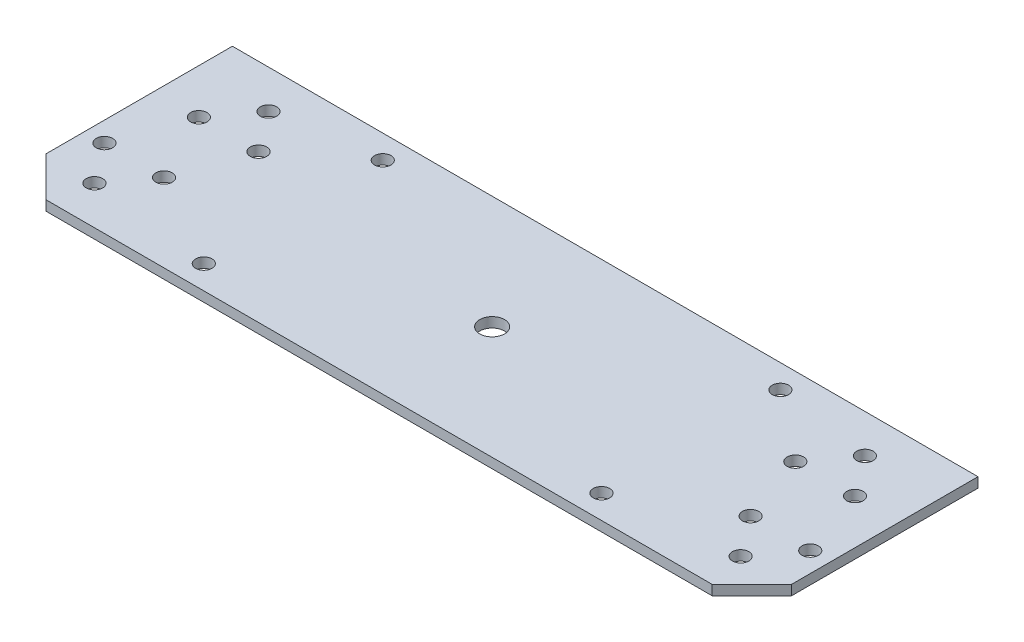
ISO-10303-21;
HEADER;
FILE_DESCRIPTION(('STEP AP214'),'2;1');
FILE_NAME('part.step','',(''),(''),'','','');
FILE_SCHEMA(('AUTOMOTIVE_DESIGN { 1 0 10303 214 1 1 1 1 }'));
ENDSEC;
DATA;
#1=APPLICATION_CONTEXT('core data for automotive mechanical design processes');
#2=APPLICATION_PROTOCOL_DEFINITION('international standard','automotive_design',2000,#1);
#3=PRODUCT_CONTEXT('',#1,'mechanical');
#4=PRODUCT('Part','Part','',(#3));
#5=PRODUCT_RELATED_PRODUCT_CATEGORY('part','',(#4));
#6=PRODUCT_DEFINITION_FORMATION('','',#4);
#7=PRODUCT_DEFINITION_CONTEXT('part definition',#1,'design');
#8=PRODUCT_DEFINITION('design','',#6,#7);
#9=PRODUCT_DEFINITION_SHAPE('','',#8);
#10=(LENGTH_UNIT() NAMED_UNIT(*) SI_UNIT(.MILLI.,.METRE.));
#11=(NAMED_UNIT(*) PLANE_ANGLE_UNIT() SI_UNIT($,.RADIAN.));
#12=(NAMED_UNIT(*) SI_UNIT($,.STERADIAN.) SOLID_ANGLE_UNIT());
#13=UNCERTAINTY_MEASURE_WITH_UNIT(LENGTH_MEASURE(1.E-05),#10,'distance_accuracy_value','');
#14=(GEOMETRIC_REPRESENTATION_CONTEXT(3) GLOBAL_UNCERTAINTY_ASSIGNED_CONTEXT((#13)) GLOBAL_UNIT_ASSIGNED_CONTEXT((#10,
#11,#12)) REPRESENTATION_CONTEXT('',''));
#15=CARTESIAN_POINT('',(0.,0.,0.));
#16=DIRECTION('',(0.,0.,1.));
#17=DIRECTION('',(1.,0.,0.));
#18=AXIS2_PLACEMENT_3D('',#15,#16,#17);
#19=CARTESIAN_POINT('',(75.,2.,22.75));
#20=DIRECTION('',(-1.,0.,0.));
#21=DIRECTION('',(0.,0.,1.));
#22=AXIS2_PLACEMENT_3D('',#19,#20,#21);
#23=PLANE('',#22);
#24=DIRECTION('',(0.,0.,-1.));
#25=VECTOR('',#24,1.);
#26=CARTESIAN_POINT('',(75.,2.,22.75));
#27=LINE('',#26,#25);
#28=CARTESIAN_POINT('',(75.,2.,14.75));
#29=VERTEX_POINT('',#28);
#30=CARTESIAN_POINT('',(75.,2.,-22.75));
#31=VERTEX_POINT('',#30);
#32=EDGE_CURVE('E89',#29,#31,#27,.T.);
#33=ORIENTED_EDGE('',*,*,#32,.F.);
#34=DIRECTION('',(0.,-1.,0.));
#35=VECTOR('',#34,1.);
#36=CARTESIAN_POINT('',(75.,2.,14.75));
#37=LINE('',#36,#35);
#38=CARTESIAN_POINT('',(75.,0.,14.75));
#39=VERTEX_POINT('',#38);
#40=EDGE_CURVE('E112',#29,#39,#37,.T.);
#41=ORIENTED_EDGE('',*,*,#40,.T.);
#42=DIRECTION('',(0.,0.,-1.));
#43=VECTOR('',#42,1.);
#44=CARTESIAN_POINT('',(75.,0.,22.75));
#45=LINE('',#44,#43);
#46=CARTESIAN_POINT('',(75.,0.,-22.75));
#47=VERTEX_POINT('',#46);
#48=EDGE_CURVE('E110',#39,#47,#45,.T.);
#49=ORIENTED_EDGE('',*,*,#48,.T.);
#50=DIRECTION('',(0.,-1.,0.));
#51=VECTOR('',#50,1.);
#52=CARTESIAN_POINT('',(75.,2.,-22.75));
#53=LINE('',#52,#51);
#54=EDGE_CURVE('E104',#31,#47,#53,.T.);
#55=ORIENTED_EDGE('',*,*,#54,.F.);
#56=EDGE_LOOP('',(#33,#41,#49,#55));
#57=FACE_BOUND('',#56,.T.);
#58=ADVANCED_FACE('F35',(#57),#23,.F.);
#59=CARTESIAN_POINT('',(-75.,2.,-22.75));
#60=DIRECTION('',(0.,0.,1.));
#61=DIRECTION('',(1.,0.,0.));
#62=AXIS2_PLACEMENT_3D('',#59,#60,#61);
#63=PLANE('',#62);
#64=DIRECTION('',(-1.,0.,0.));
#65=VECTOR('',#64,1.);
#66=CARTESIAN_POINT('',(-75.,0.,-22.75));
#67=LINE('',#66,#65);
#68=CARTESIAN_POINT('',(-75.,0.,-22.75));
#69=VERTEX_POINT('',#68);
#70=EDGE_CURVE('E139',#47,#69,#67,.T.);
#71=ORIENTED_EDGE('',*,*,#70,.T.);
#72=DIRECTION('',(0.,-1.,0.));
#73=VECTOR('',#72,1.);
#74=CARTESIAN_POINT('',(-75.,2.,-22.75));
#75=LINE('',#74,#73);
#76=CARTESIAN_POINT('',(-75.,2.,-22.75));
#77=VERTEX_POINT('',#76);
#78=EDGE_CURVE('E106',#77,#69,#75,.T.);
#79=ORIENTED_EDGE('',*,*,#78,.F.);
#80=DIRECTION('',(-1.,0.,0.));
#81=VECTOR('',#80,1.);
#82=CARTESIAN_POINT('',(-75.,2.,-22.75));
#83=LINE('',#82,#81);
#84=EDGE_CURVE('E92',#31,#77,#83,.T.);
#85=ORIENTED_EDGE('',*,*,#84,.F.);
#86=ORIENTED_EDGE('',*,*,#54,.T.);
#87=EDGE_LOOP('',(#71,#79,#85,#86));
#88=FACE_BOUND('',#87,.T.);
#89=ADVANCED_FACE('F103',(#88),#63,.F.);
#90=CARTESIAN_POINT('',(-75.,2.,22.75));
#91=DIRECTION('',(1.,0.,0.));
#92=DIRECTION('',(0.,0.,-1.));
#93=AXIS2_PLACEMENT_3D('',#90,#91,#92);
#94=PLANE('',#93);
#95=DIRECTION('',(0.,0.,1.));
#96=VECTOR('',#95,1.);
#97=CARTESIAN_POINT('',(-75.,0.,22.75));
#98=LINE('',#97,#96);
#99=CARTESIAN_POINT('',(-75.,0.,14.75));
#100=VERTEX_POINT('',#99);
#101=EDGE_CURVE('E137',#69,#100,#98,.T.);
#102=ORIENTED_EDGE('',*,*,#101,.T.);
#103=DIRECTION('',(0.,1.,0.));
#104=VECTOR('',#103,1.);
#105=CARTESIAN_POINT('',(-75.,2.,14.75));
#106=LINE('',#105,#104);
#107=CARTESIAN_POINT('',(-75.,2.,14.75));
#108=VERTEX_POINT('',#107);
#109=EDGE_CURVE('E11',#100,#108,#106,.T.);
#110=ORIENTED_EDGE('',*,*,#109,.T.);
#111=DIRECTION('',(0.,0.,1.));
#112=VECTOR('',#111,1.);
#113=CARTESIAN_POINT('',(-75.,2.,22.75));
#114=LINE('',#113,#112);
#115=EDGE_CURVE('E107',#77,#108,#114,.T.);
#116=ORIENTED_EDGE('',*,*,#115,.F.);
#117=ORIENTED_EDGE('',*,*,#78,.T.);
#118=EDGE_LOOP('',(#102,#110,#116,#117));
#119=FACE_BOUND('',#118,.T.);
#120=ADVANCED_FACE('F138',(#119),#94,.F.);
#121=CARTESIAN_POINT('',(-75.,2.,22.75));
#122=DIRECTION('',(0.,0.,-1.));
#123=DIRECTION('',(-1.,0.,0.));
#124=AXIS2_PLACEMENT_3D('',#121,#122,#123);
#125=PLANE('',#124);
#126=DIRECTION('',(1.,0.,0.));
#127=VECTOR('',#126,1.);
#128=CARTESIAN_POINT('',(-75.,0.,22.75));
#129=LINE('',#128,#127);
#130=CARTESIAN_POINT('',(-67.,0.,22.75));
#131=VERTEX_POINT('',#130);
#132=CARTESIAN_POINT('',(66.9999999999999,0.,22.75));
#133=VERTEX_POINT('',#132);
#134=EDGE_CURVE('E99',#131,#133,#129,.T.);
#135=ORIENTED_EDGE('',*,*,#134,.T.);
#136=DIRECTION('',(0.,1.,0.));
#137=VECTOR('',#136,1.);
#138=CARTESIAN_POINT('',(66.9999999999999,2.,22.75));
#139=LINE('',#138,#137);
#140=CARTESIAN_POINT('',(66.9999999999999,2.,22.75));
#141=VERTEX_POINT('',#140);
#142=EDGE_CURVE('E56',#133,#141,#139,.T.);
#143=ORIENTED_EDGE('',*,*,#142,.T.);
#144=DIRECTION('',(1.,0.,0.));
#145=VECTOR('',#144,1.);
#146=CARTESIAN_POINT('',(-75.,2.,22.75));
#147=LINE('',#146,#145);
#148=CARTESIAN_POINT('',(-67.,2.,22.75));
#149=VERTEX_POINT('',#148);
#150=EDGE_CURVE('E116',#149,#141,#147,.T.);
#151=ORIENTED_EDGE('',*,*,#150,.F.);
#152=DIRECTION('',(0.,-1.,0.));
#153=VECTOR('',#152,1.);
#154=CARTESIAN_POINT('',(-67.,2.,22.75));
#155=LINE('',#154,#153);
#156=EDGE_CURVE('E123',#149,#131,#155,.T.);
#157=ORIENTED_EDGE('',*,*,#156,.T.);
#158=EDGE_LOOP('',(#135,#143,#151,#157));
#159=FACE_BOUND('',#158,.T.);
#160=ADVANCED_FACE('F131',(#159),#125,.F.);
#161=CARTESIAN_POINT('',(0.,2.,0.));
#162=DIRECTION('',(0.,-1.,0.));
#163=DIRECTION('',(0.,0.,-1.));
#164=AXIS2_PLACEMENT_3D('',#161,#162,#163);
#165=PLANE('',#164);
#166=CARTESIAN_POINT('',(-40.,2.,18.));
#167=DIRECTION('',(0.,1.,0.));
#168=DIRECTION('',(0.,0.,1.));
#169=AXIS2_PLACEMENT_3D('',#166,#167,#168);
#170=CIRCLE('',#169,1.65);
#171=CARTESIAN_POINT('',(-40.,2.,19.65));
#172=VERTEX_POINT('',#171);
#173=EDGE_CURVE('E227',#172,#172,#170,.T.);
#174=ORIENTED_EDGE('',*,*,#173,.F.);
#175=EDGE_LOOP('',(#174));
#176=FACE_BOUND('',#175,.T.);
#177=CARTESIAN_POINT('',(40.,2.,-18.));
#178=DIRECTION('',(0.,1.,0.));
#179=DIRECTION('',(0.,0.,1.));
#180=AXIS2_PLACEMENT_3D('',#177,#178,#179);
#181=CIRCLE('',#180,1.65);
#182=CARTESIAN_POINT('',(40.,2.,-16.35));
#183=VERTEX_POINT('',#182);
#184=EDGE_CURVE('E233',#183,#183,#181,.T.);
#185=ORIENTED_EDGE('',*,*,#184,.F.);
#186=EDGE_LOOP('',(#185));
#187=FACE_BOUND('',#186,.T.);
#188=CARTESIAN_POINT('',(40.,2.,18.));
#189=DIRECTION('',(0.,1.,0.));
#190=DIRECTION('',(0.,0.,1.));
#191=AXIS2_PLACEMENT_3D('',#188,#189,#190);
#192=CIRCLE('',#191,1.65);
#193=CARTESIAN_POINT('',(40.,2.,19.65));
#194=VERTEX_POINT('',#193);
#195=EDGE_CURVE('E234',#194,#194,#192,.T.);
#196=ORIENTED_EDGE('',*,*,#195,.F.);
#197=EDGE_LOOP('',(#196));
#198=FACE_BOUND('',#197,.T.);
#199=CARTESIAN_POINT('',(-40.,2.,-18.));
#200=DIRECTION('',(0.,1.,0.));
#201=DIRECTION('',(0.,0.,1.));
#202=AXIS2_PLACEMENT_3D('',#199,#200,#201);
#203=CIRCLE('',#202,1.65);
#204=CARTESIAN_POINT('',(-40.,2.,-16.35));
#205=VERTEX_POINT('',#204);
#206=EDGE_CURVE('E221',#205,#205,#203,.T.);
#207=ORIENTED_EDGE('',*,*,#206,.F.);
#208=EDGE_LOOP('',(#207));
#209=FACE_BOUND('',#208,.T.);
#210=CARTESIAN_POINT('',(0.,2.,0.));
#211=DIRECTION('',(0.,1.,0.));
#212=DIRECTION('',(0.,0.,1.));
#213=AXIS2_PLACEMENT_3D('',#210,#211,#212);
#214=CIRCLE('',#213,2.5);
#215=CARTESIAN_POINT('',(0.,2.,2.5));
#216=VERTEX_POINT('',#215);
#217=EDGE_CURVE('E189',#216,#216,#214,.T.);
#218=ORIENTED_EDGE('',*,*,#217,.F.);
#219=EDGE_LOOP('',(#218));
#220=FACE_BOUND('',#219,.T.);
#221=CARTESIAN_POINT('',(60.,2.,-15.));
#222=DIRECTION('',(0.,-1.,0.));
#223=DIRECTION('',(0.,0.,1.));
#224=AXIS2_PLACEMENT_3D('',#221,#222,#223);
#225=CIRCLE('',#224,1.64999999999999);
#226=CARTESIAN_POINT('',(60.,2.,-13.35));
#227=VERTEX_POINT('',#226);
#228=EDGE_CURVE('E211',#227,#227,#225,.T.);
#229=ORIENTED_EDGE('',*,*,#228,.T.);
#230=EDGE_LOOP('',(#229));
#231=FACE_BOUND('',#230,.T.);
#232=CARTESIAN_POINT('',(65.9999999999999,2.,-7.));
#233=DIRECTION('',(0.,-1.,0.));
#234=DIRECTION('',(0.,0.,1.));
#235=AXIS2_PLACEMENT_3D('',#232,#233,#234);
#236=CIRCLE('',#235,1.65);
#237=CARTESIAN_POINT('',(65.9999999999999,2.,-5.35));
#238=VERTEX_POINT('',#237);
#239=EDGE_CURVE('E205',#238,#238,#236,.T.);
#240=ORIENTED_EDGE('',*,*,#239,.T.);
#241=EDGE_LOOP('',(#240));
#242=FACE_BOUND('',#241,.T.);
#243=CARTESIAN_POINT('',(54.,2.,-7.));
#244=DIRECTION('',(0.,-1.,0.));
#245=DIRECTION('',(0.,0.,1.));
#246=AXIS2_PLACEMENT_3D('',#243,#244,#245);
#247=CIRCLE('',#246,1.65);
#248=CARTESIAN_POINT('',(54.,2.,-5.35));
#249=VERTEX_POINT('',#248);
#250=EDGE_CURVE('E199',#249,#249,#247,.T.);
#251=ORIENTED_EDGE('',*,*,#250,.T.);
#252=EDGE_LOOP('',(#251));
#253=FACE_BOUND('',#252,.T.);
#254=CARTESIAN_POINT('',(70.9999999999999,2.,7.));
#255=DIRECTION('',(0.,-1.,0.));
#256=DIRECTION('',(0.,0.,1.));
#257=AXIS2_PLACEMENT_3D('',#254,#255,#256);
#258=CIRCLE('',#257,1.65);
#259=CARTESIAN_POINT('',(70.9999999999999,2.,8.65000000000001));
#260=VERTEX_POINT('',#259);
#261=EDGE_CURVE('E193',#260,#260,#258,.T.);
#262=ORIENTED_EDGE('',*,*,#261,.T.);
#263=EDGE_LOOP('',(#262));
#264=FACE_BOUND('',#263,.T.);
#265=CARTESIAN_POINT('',(58.9999999999999,2.,7.));
#266=DIRECTION('',(0.,-1.,0.));
#267=DIRECTION('',(0.,0.,1.));
#268=AXIS2_PLACEMENT_3D('',#265,#266,#267);
#269=CIRCLE('',#268,1.65);
#270=CARTESIAN_POINT('',(58.9999999999999,2.,8.65000000000001));
#271=VERTEX_POINT('',#270);
#272=EDGE_CURVE('E185',#271,#271,#269,.T.);
#273=ORIENTED_EDGE('',*,*,#272,.T.);
#274=EDGE_LOOP('',(#273));
#275=FACE_BOUND('',#274,.T.);
#276=CARTESIAN_POINT('',(64.9999999999999,2.,15.));
#277=DIRECTION('',(0.,-1.,0.));
#278=DIRECTION('',(0.,0.,1.));
#279=AXIS2_PLACEMENT_3D('',#276,#277,#278);
#280=CIRCLE('',#279,1.65);
#281=CARTESIAN_POINT('',(64.9999999999999,2.,16.65));
#282=VERTEX_POINT('',#281);
#283=EDGE_CURVE('E186',#282,#282,#280,.T.);
#284=ORIENTED_EDGE('',*,*,#283,.T.);
#285=EDGE_LOOP('',(#284));
#286=FACE_BOUND('',#285,.T.);
#287=CARTESIAN_POINT('',(-60.,2.,-15.));
#288=DIRECTION('',(0.,1.,0.));
#289=DIRECTION('',(0.,0.,1.));
#290=AXIS2_PLACEMENT_3D('',#287,#288,#289);
#291=CIRCLE('',#290,1.64999999999999);
#292=CARTESIAN_POINT('',(-60.,2.,-13.35));
#293=VERTEX_POINT('',#292);
#294=EDGE_CURVE('E143',#293,#293,#291,.T.);
#295=ORIENTED_EDGE('',*,*,#294,.F.);
#296=EDGE_LOOP('',(#295));
#297=FACE_BOUND('',#296,.T.);
#298=CARTESIAN_POINT('',(-65.9999999999999,2.,-7.));
#299=DIRECTION('',(0.,1.,0.));
#300=DIRECTION('',(0.,0.,1.));
#301=AXIS2_PLACEMENT_3D('',#298,#299,#300);
#302=CIRCLE('',#301,1.65);
#303=CARTESIAN_POINT('',(-65.9999999999999,2.,-5.35));
#304=VERTEX_POINT('',#303);
#305=EDGE_CURVE('E174',#304,#304,#302,.T.);
#306=ORIENTED_EDGE('',*,*,#305,.F.);
#307=EDGE_LOOP('',(#306));
#308=FACE_BOUND('',#307,.T.);
#309=CARTESIAN_POINT('',(-54.,2.,-7.));
#310=DIRECTION('',(0.,1.,0.));
#311=DIRECTION('',(0.,0.,1.));
#312=AXIS2_PLACEMENT_3D('',#309,#310,#311);
#313=CIRCLE('',#312,1.65);
#314=CARTESIAN_POINT('',(-54.,2.,-5.35));
#315=VERTEX_POINT('',#314);
#316=EDGE_CURVE('E168',#315,#315,#313,.T.);
#317=ORIENTED_EDGE('',*,*,#316,.F.);
#318=EDGE_LOOP('',(#317));
#319=FACE_BOUND('',#318,.T.);
#320=CARTESIAN_POINT('',(-70.9999999999999,2.,7.));
#321=DIRECTION('',(0.,1.,0.));
#322=DIRECTION('',(0.,0.,1.));
#323=AXIS2_PLACEMENT_3D('',#320,#321,#322);
#324=CIRCLE('',#323,1.65);
#325=CARTESIAN_POINT('',(-70.9999999999999,2.,8.65000000000001));
#326=VERTEX_POINT('',#325);
#327=EDGE_CURVE('E162',#326,#326,#324,.T.);
#328=ORIENTED_EDGE('',*,*,#327,.F.);
#329=EDGE_LOOP('',(#328));
#330=FACE_BOUND('',#329,.T.);
#331=CARTESIAN_POINT('',(-58.9999999999999,2.,7.));
#332=DIRECTION('',(0.,1.,0.));
#333=DIRECTION('',(0.,0.,1.));
#334=AXIS2_PLACEMENT_3D('',#331,#332,#333);
#335=CIRCLE('',#334,1.65);
#336=CARTESIAN_POINT('',(-58.9999999999999,2.,8.65000000000001));
#337=VERTEX_POINT('',#336);
#338=EDGE_CURVE('E156',#337,#337,#335,.T.);
#339=ORIENTED_EDGE('',*,*,#338,.F.);
#340=EDGE_LOOP('',(#339));
#341=FACE_BOUND('',#340,.T.);
#342=CARTESIAN_POINT('',(-64.9999999999999,2.,15.));
#343=DIRECTION('',(0.,1.,0.));
#344=DIRECTION('',(0.,0.,1.));
#345=AXIS2_PLACEMENT_3D('',#342,#343,#344);
#346=CIRCLE('',#345,1.65);
#347=CARTESIAN_POINT('',(-64.9999999999999,2.,16.65));
#348=VERTEX_POINT('',#347);
#349=EDGE_CURVE('E149',#348,#348,#346,.T.);
#350=ORIENTED_EDGE('',*,*,#349,.F.);
#351=EDGE_LOOP('',(#350));
#352=FACE_BOUND('',#351,.T.);
#353=ORIENTED_EDGE('',*,*,#150,.T.);
#354=DIRECTION('',(-0.707106781186549,0.,0.707106781186546));
#355=VECTOR('',#354,1.);
#356=CARTESIAN_POINT('',(75.,2.,14.75));
#357=LINE('',#356,#355);
#358=EDGE_CURVE('E43',#141,#29,#357,.F.);
#359=ORIENTED_EDGE('',*,*,#358,.T.);
#360=ORIENTED_EDGE('',*,*,#32,.T.);
#361=ORIENTED_EDGE('',*,*,#84,.T.);
#362=ORIENTED_EDGE('',*,*,#115,.T.);
#363=DIRECTION('',(-0.707106781186547,0.,-0.707106781186548));
#364=VECTOR('',#363,1.);
#365=CARTESIAN_POINT('',(-67.,2.,22.75));
#366=LINE('',#365,#364);
#367=EDGE_CURVE('E127',#108,#149,#366,.F.);
#368=ORIENTED_EDGE('',*,*,#367,.T.);
#369=EDGE_LOOP('',(#353,#359,#360,#361,#362,#368));
#370=FACE_BOUND('',#369,.T.);
#371=ADVANCED_FACE('F91',(#176,#187,#198,#209,#220,#231,#242,#253,#264,#275,#286,#297,#308,#319,
#330,#341,#352,#370),#165,.F.);
#372=CARTESIAN_POINT('',(0.,0.,0.));
#373=DIRECTION('',(0.,-1.,0.));
#374=DIRECTION('',(0.,0.,-1.));
#375=AXIS2_PLACEMENT_3D('',#372,#373,#374);
#376=PLANE('',#375);
#377=CARTESIAN_POINT('',(-40.,0.,18.));
#378=DIRECTION('',(0.,-1.,0.));
#379=DIRECTION('',(0.,0.,-1.));
#380=AXIS2_PLACEMENT_3D('',#377,#378,#379);
#381=CIRCLE('',#380,1.65);
#382=CARTESIAN_POINT('',(-40.,0.,16.35));
#383=VERTEX_POINT('',#382);
#384=EDGE_CURVE('E237',#383,#383,#381,.F.);
#385=ORIENTED_EDGE('',*,*,#384,.T.);
#386=EDGE_LOOP('',(#385));
#387=FACE_BOUND('',#386,.T.);
#388=CARTESIAN_POINT('',(40.,0.,-18.));
#389=DIRECTION('',(0.,-1.,0.));
#390=DIRECTION('',(0.,0.,-1.));
#391=AXIS2_PLACEMENT_3D('',#388,#389,#390);
#392=CIRCLE('',#391,1.65);
#393=CARTESIAN_POINT('',(40.,0.,-19.65));
#394=VERTEX_POINT('',#393);
#395=EDGE_CURVE('E230',#394,#394,#392,.F.);
#396=ORIENTED_EDGE('',*,*,#395,.T.);
#397=EDGE_LOOP('',(#396));
#398=FACE_BOUND('',#397,.T.);
#399=CARTESIAN_POINT('',(40.,0.,18.));
#400=DIRECTION('',(0.,-1.,0.));
#401=DIRECTION('',(0.,0.,-1.));
#402=AXIS2_PLACEMENT_3D('',#399,#400,#401);
#403=CIRCLE('',#402,1.65);
#404=CARTESIAN_POINT('',(40.,0.,16.35));
#405=VERTEX_POINT('',#404);
#406=EDGE_CURVE('E242',#405,#405,#403,.F.);
#407=ORIENTED_EDGE('',*,*,#406,.T.);
#408=EDGE_LOOP('',(#407));
#409=FACE_BOUND('',#408,.T.);
#410=CARTESIAN_POINT('',(-40.,0.,-18.));
#411=DIRECTION('',(0.,-1.,0.));
#412=DIRECTION('',(0.,0.,-1.));
#413=AXIS2_PLACEMENT_3D('',#410,#411,#412);
#414=CIRCLE('',#413,1.65);
#415=CARTESIAN_POINT('',(-40.,0.,-19.65));
#416=VERTEX_POINT('',#415);
#417=EDGE_CURVE('E224',#416,#416,#414,.F.);
#418=ORIENTED_EDGE('',*,*,#417,.T.);
#419=EDGE_LOOP('',(#418));
#420=FACE_BOUND('',#419,.T.);
#421=CARTESIAN_POINT('',(0.,0.,0.));
#422=DIRECTION('',(0.,-1.,0.));
#423=DIRECTION('',(0.,0.,-1.));
#424=AXIS2_PLACEMENT_3D('',#421,#422,#423);
#425=CIRCLE('',#424,2.5);
#426=CARTESIAN_POINT('',(0.,0.,-2.5));
#427=VERTEX_POINT('',#426);
#428=EDGE_CURVE('E218',#427,#427,#425,.F.);
#429=ORIENTED_EDGE('',*,*,#428,.T.);
#430=EDGE_LOOP('',(#429));
#431=FACE_BOUND('',#430,.T.);
#432=CARTESIAN_POINT('',(60.,0.,-15.));
#433=DIRECTION('',(0.,-1.,0.));
#434=DIRECTION('',(0.,0.,-1.));
#435=AXIS2_PLACEMENT_3D('',#432,#433,#434);
#436=CIRCLE('',#435,1.64999999999999);
#437=CARTESIAN_POINT('',(60.,0.,-16.65));
#438=VERTEX_POINT('',#437);
#439=EDGE_CURVE('E150',#438,#438,#436,.T.);
#440=ORIENTED_EDGE('',*,*,#439,.F.);
#441=EDGE_LOOP('',(#440));
#442=FACE_BOUND('',#441,.T.);
#443=CARTESIAN_POINT('',(65.9999999999999,0.,-7.));
#444=DIRECTION('',(0.,-1.,0.));
#445=DIRECTION('',(0.,0.,-1.));
#446=AXIS2_PLACEMENT_3D('',#443,#444,#445);
#447=CIRCLE('',#446,1.65);
#448=CARTESIAN_POINT('',(65.9999999999999,0.,-8.65));
#449=VERTEX_POINT('',#448);
#450=EDGE_CURVE('E208',#449,#449,#447,.T.);
#451=ORIENTED_EDGE('',*,*,#450,.F.);
#452=EDGE_LOOP('',(#451));
#453=FACE_BOUND('',#452,.T.);
#454=CARTESIAN_POINT('',(54.,0.,-7.));
#455=DIRECTION('',(0.,-1.,0.));
#456=DIRECTION('',(0.,0.,-1.));
#457=AXIS2_PLACEMENT_3D('',#454,#455,#456);
#458=CIRCLE('',#457,1.65);
#459=CARTESIAN_POINT('',(54.,0.,-8.65));
#460=VERTEX_POINT('',#459);
#461=EDGE_CURVE('E202',#460,#460,#458,.T.);
#462=ORIENTED_EDGE('',*,*,#461,.F.);
#463=EDGE_LOOP('',(#462));
#464=FACE_BOUND('',#463,.T.);
#465=CARTESIAN_POINT('',(70.9999999999999,0.,7.));
#466=DIRECTION('',(0.,-1.,0.));
#467=DIRECTION('',(0.,0.,-1.));
#468=AXIS2_PLACEMENT_3D('',#465,#466,#467);
#469=CIRCLE('',#468,1.65);
#470=CARTESIAN_POINT('',(70.9999999999999,0.,5.35));
#471=VERTEX_POINT('',#470);
#472=EDGE_CURVE('E196',#471,#471,#469,.T.);
#473=ORIENTED_EDGE('',*,*,#472,.F.);
#474=EDGE_LOOP('',(#473));
#475=FACE_BOUND('',#474,.T.);
#476=CARTESIAN_POINT('',(58.9999999999999,0.,7.));
#477=DIRECTION('',(0.,-1.,0.));
#478=DIRECTION('',(0.,0.,-1.));
#479=AXIS2_PLACEMENT_3D('',#476,#477,#478);
#480=CIRCLE('',#479,1.65);
#481=CARTESIAN_POINT('',(58.9999999999999,0.,5.35));
#482=VERTEX_POINT('',#481);
#483=EDGE_CURVE('E190',#482,#482,#480,.T.);
#484=ORIENTED_EDGE('',*,*,#483,.F.);
#485=EDGE_LOOP('',(#484));
#486=FACE_BOUND('',#485,.T.);
#487=CARTESIAN_POINT('',(64.9999999999999,0.,15.));
#488=DIRECTION('',(0.,-1.,0.));
#489=DIRECTION('',(0.,0.,-1.));
#490=AXIS2_PLACEMENT_3D('',#487,#488,#489);
#491=CIRCLE('',#490,1.65);
#492=CARTESIAN_POINT('',(64.9999999999999,0.,13.35));
#493=VERTEX_POINT('',#492);
#494=EDGE_CURVE('E182',#493,#493,#491,.T.);
#495=ORIENTED_EDGE('',*,*,#494,.F.);
#496=EDGE_LOOP('',(#495));
#497=FACE_BOUND('',#496,.T.);
#498=CARTESIAN_POINT('',(-60.,0.,-15.));
#499=DIRECTION('',(0.,-1.,0.));
#500=DIRECTION('',(0.,0.,-1.));
#501=AXIS2_PLACEMENT_3D('',#498,#499,#500);
#502=CIRCLE('',#501,1.64999999999999);
#503=CARTESIAN_POINT('',(-60.,0.,-16.65));
#504=VERTEX_POINT('',#503);
#505=EDGE_CURVE('E177',#504,#504,#502,.F.);
#506=ORIENTED_EDGE('',*,*,#505,.T.);
#507=EDGE_LOOP('',(#506));
#508=FACE_BOUND('',#507,.T.);
#509=CARTESIAN_POINT('',(-65.9999999999999,0.,-7.));
#510=DIRECTION('',(0.,-1.,0.));
#511=DIRECTION('',(0.,0.,-1.));
#512=AXIS2_PLACEMENT_3D('',#509,#510,#511);
#513=CIRCLE('',#512,1.65);
#514=CARTESIAN_POINT('',(-65.9999999999999,0.,-8.65));
#515=VERTEX_POINT('',#514);
#516=EDGE_CURVE('E171',#515,#515,#513,.F.);
#517=ORIENTED_EDGE('',*,*,#516,.T.);
#518=EDGE_LOOP('',(#517));
#519=FACE_BOUND('',#518,.T.);
#520=CARTESIAN_POINT('',(-54.,0.,-7.));
#521=DIRECTION('',(0.,-1.,0.));
#522=DIRECTION('',(0.,0.,-1.));
#523=AXIS2_PLACEMENT_3D('',#520,#521,#522);
#524=CIRCLE('',#523,1.65);
#525=CARTESIAN_POINT('',(-54.,0.,-8.65));
#526=VERTEX_POINT('',#525);
#527=EDGE_CURVE('E165',#526,#526,#524,.F.);
#528=ORIENTED_EDGE('',*,*,#527,.T.);
#529=EDGE_LOOP('',(#528));
#530=FACE_BOUND('',#529,.T.);
#531=CARTESIAN_POINT('',(-70.9999999999999,0.,7.));
#532=DIRECTION('',(0.,-1.,0.));
#533=DIRECTION('',(0.,0.,-1.));
#534=AXIS2_PLACEMENT_3D('',#531,#532,#533);
#535=CIRCLE('',#534,1.65);
#536=CARTESIAN_POINT('',(-70.9999999999999,0.,5.35));
#537=VERTEX_POINT('',#536);
#538=EDGE_CURVE('E159',#537,#537,#535,.F.);
#539=ORIENTED_EDGE('',*,*,#538,.T.);
#540=EDGE_LOOP('',(#539));
#541=FACE_BOUND('',#540,.T.);
#542=CARTESIAN_POINT('',(-58.9999999999999,0.,7.));
#543=DIRECTION('',(0.,-1.,0.));
#544=DIRECTION('',(0.,0.,-1.));
#545=AXIS2_PLACEMENT_3D('',#542,#543,#544);
#546=CIRCLE('',#545,1.65);
#547=CARTESIAN_POINT('',(-58.9999999999999,0.,5.35));
#548=VERTEX_POINT('',#547);
#549=EDGE_CURVE('E153',#548,#548,#546,.F.);
#550=ORIENTED_EDGE('',*,*,#549,.T.);
#551=EDGE_LOOP('',(#550));
#552=FACE_BOUND('',#551,.T.);
#553=CARTESIAN_POINT('',(-64.9999999999999,0.,15.));
#554=DIRECTION('',(0.,-1.,0.));
#555=DIRECTION('',(0.,0.,-1.));
#556=AXIS2_PLACEMENT_3D('',#553,#554,#555);
#557=CIRCLE('',#556,1.65);
#558=CARTESIAN_POINT('',(-64.9999999999999,0.,13.35));
#559=VERTEX_POINT('',#558);
#560=EDGE_CURVE('E146',#559,#559,#557,.F.);
#561=ORIENTED_EDGE('',*,*,#560,.T.);
#562=EDGE_LOOP('',(#561));
#563=FACE_BOUND('',#562,.T.);
#564=ORIENTED_EDGE('',*,*,#48,.F.);
#565=DIRECTION('',(0.707106781186549,0.,-0.707106781186546));
#566=VECTOR('',#565,1.);
#567=CARTESIAN_POINT('',(44.8749999999998,0.,44.875));
#568=LINE('',#567,#566);
#569=EDGE_CURVE('E121',#39,#133,#568,.F.);
#570=ORIENTED_EDGE('',*,*,#569,.T.);
#571=ORIENTED_EDGE('',*,*,#134,.F.);
#572=DIRECTION('',(0.707106781186547,0.,0.707106781186548));
#573=VECTOR('',#572,1.);
#574=CARTESIAN_POINT('',(-44.8750000000001,0.,44.875));
#575=LINE('',#574,#573);
#576=EDGE_CURVE('E114',#131,#100,#575,.F.);
#577=ORIENTED_EDGE('',*,*,#576,.T.);
#578=ORIENTED_EDGE('',*,*,#101,.F.);
#579=ORIENTED_EDGE('',*,*,#70,.F.);
#580=EDGE_LOOP('',(#564,#570,#571,#577,#578,#579));
#581=FACE_BOUND('',#580,.T.);
#582=ADVANCED_FACE('F136',(#387,#398,#409,#420,#431,#442,#453,#464,#475,#486,#497,#508,#519,
#530,#541,#552,#563,#581),#376,.T.);
#583=CARTESIAN_POINT('',(-64.9999999999999,-0.00100000000000013,15.));
#584=DIRECTION('',(0.,1.,0.));
#585=DIRECTION('',(0.,0.,1.));
#586=AXIS2_PLACEMENT_3D('',#583,#584,#585);
#587=CYLINDRICAL_SURFACE('',#586,1.65);
#588=ORIENTED_EDGE('',*,*,#560,.F.);
#589=EDGE_LOOP('',(#588));
#590=FACE_BOUND('',#589,.T.);
#591=ORIENTED_EDGE('',*,*,#349,.T.);
#592=EDGE_LOOP('',(#591));
#593=FACE_BOUND('',#592,.T.);
#594=ADVANCED_FACE('F282',(#590,#593),#587,.F.);
#595=CARTESIAN_POINT('',(-58.9999999999999,-0.00100000000000013,7.));
#596=DIRECTION('',(0.,1.,0.));
#597=DIRECTION('',(0.,0.,1.));
#598=AXIS2_PLACEMENT_3D('',#595,#596,#597);
#599=CYLINDRICAL_SURFACE('',#598,1.65);
#600=ORIENTED_EDGE('',*,*,#549,.F.);
#601=EDGE_LOOP('',(#600));
#602=FACE_BOUND('',#601,.T.);
#603=ORIENTED_EDGE('',*,*,#338,.T.);
#604=EDGE_LOOP('',(#603));
#605=FACE_BOUND('',#604,.T.);
#606=ADVANCED_FACE('F284',(#602,#605),#599,.F.);
#607=CARTESIAN_POINT('',(-70.9999999999999,-0.00100000000000013,7.));
#608=DIRECTION('',(0.,1.,0.));
#609=DIRECTION('',(0.,0.,1.));
#610=AXIS2_PLACEMENT_3D('',#607,#608,#609);
#611=CYLINDRICAL_SURFACE('',#610,1.65);
#612=ORIENTED_EDGE('',*,*,#538,.F.);
#613=EDGE_LOOP('',(#612));
#614=FACE_BOUND('',#613,.T.);
#615=ORIENTED_EDGE('',*,*,#327,.T.);
#616=EDGE_LOOP('',(#615));
#617=FACE_BOUND('',#616,.T.);
#618=ADVANCED_FACE('F291',(#614,#617),#611,.F.);
#619=CARTESIAN_POINT('',(-54.,-0.00100000000000013,-7.));
#620=DIRECTION('',(0.,1.,0.));
#621=DIRECTION('',(0.,0.,1.));
#622=AXIS2_PLACEMENT_3D('',#619,#620,#621);
#623=CYLINDRICAL_SURFACE('',#622,1.65);
#624=ORIENTED_EDGE('',*,*,#527,.F.);
#625=EDGE_LOOP('',(#624));
#626=FACE_BOUND('',#625,.T.);
#627=ORIENTED_EDGE('',*,*,#316,.T.);
#628=EDGE_LOOP('',(#627));
#629=FACE_BOUND('',#628,.T.);
#630=ADVANCED_FACE('F348',(#626,#629),#623,.F.);
#631=CARTESIAN_POINT('',(-65.9999999999999,-0.00100000000000013,-7.));
#632=DIRECTION('',(0.,1.,0.));
#633=DIRECTION('',(0.,0.,1.));
#634=AXIS2_PLACEMENT_3D('',#631,#632,#633);
#635=CYLINDRICAL_SURFACE('',#634,1.65);
#636=ORIENTED_EDGE('',*,*,#516,.F.);
#637=EDGE_LOOP('',(#636));
#638=FACE_BOUND('',#637,.T.);
#639=ORIENTED_EDGE('',*,*,#305,.T.);
#640=EDGE_LOOP('',(#639));
#641=FACE_BOUND('',#640,.T.);
#642=ADVANCED_FACE('F344',(#638,#641),#635,.F.);
#643=CARTESIAN_POINT('',(-60.,-0.00100000000000013,-15.));
#644=DIRECTION('',(0.,1.,0.));
#645=DIRECTION('',(0.,0.,1.));
#646=AXIS2_PLACEMENT_3D('',#643,#644,#645);
#647=CYLINDRICAL_SURFACE('',#646,1.64999999999999);
#648=ORIENTED_EDGE('',*,*,#505,.F.);
#649=EDGE_LOOP('',(#648));
#650=FACE_BOUND('',#649,.T.);
#651=ORIENTED_EDGE('',*,*,#294,.T.);
#652=EDGE_LOOP('',(#651));
#653=FACE_BOUND('',#652,.T.);
#654=ADVANCED_FACE('F340',(#650,#653),#647,.F.);
#655=CARTESIAN_POINT('',(64.9999999999999,-0.00100000000000013,15.));
#656=DIRECTION('',(0.,1.,0.));
#657=DIRECTION('',(0.,0.,1.));
#658=AXIS2_PLACEMENT_3D('',#655,#656,#657);
#659=CYLINDRICAL_SURFACE('',#658,1.65);
#660=ORIENTED_EDGE('',*,*,#494,.T.);
#661=EDGE_LOOP('',(#660));
#662=FACE_BOUND('',#661,.T.);
#663=ORIENTED_EDGE('',*,*,#283,.F.);
#664=EDGE_LOOP('',(#663));
#665=FACE_BOUND('',#664,.T.);
#666=ADVANCED_FACE('F336',(#662,#665),#659,.F.);
#667=CARTESIAN_POINT('',(58.9999999999999,-0.00100000000000013,7.));
#668=DIRECTION('',(0.,1.,0.));
#669=DIRECTION('',(0.,0.,1.));
#670=AXIS2_PLACEMENT_3D('',#667,#668,#669);
#671=CYLINDRICAL_SURFACE('',#670,1.65);
#672=ORIENTED_EDGE('',*,*,#483,.T.);
#673=EDGE_LOOP('',(#672));
#674=FACE_BOUND('',#673,.T.);
#675=ORIENTED_EDGE('',*,*,#272,.F.);
#676=EDGE_LOOP('',(#675));
#677=FACE_BOUND('',#676,.T.);
#678=ADVANCED_FACE('F332',(#674,#677),#671,.F.);
#679=CARTESIAN_POINT('',(70.9999999999999,-0.00100000000000013,7.));
#680=DIRECTION('',(0.,1.,0.));
#681=DIRECTION('',(0.,0.,1.));
#682=AXIS2_PLACEMENT_3D('',#679,#680,#681);
#683=CYLINDRICAL_SURFACE('',#682,1.65);
#684=ORIENTED_EDGE('',*,*,#472,.T.);
#685=EDGE_LOOP('',(#684));
#686=FACE_BOUND('',#685,.T.);
#687=ORIENTED_EDGE('',*,*,#261,.F.);
#688=EDGE_LOOP('',(#687));
#689=FACE_BOUND('',#688,.T.);
#690=ADVANCED_FACE('F328',(#686,#689),#683,.F.);
#691=CARTESIAN_POINT('',(54.,-0.00100000000000013,-7.));
#692=DIRECTION('',(0.,1.,0.));
#693=DIRECTION('',(0.,0.,1.));
#694=AXIS2_PLACEMENT_3D('',#691,#692,#693);
#695=CYLINDRICAL_SURFACE('',#694,1.65);
#696=ORIENTED_EDGE('',*,*,#461,.T.);
#697=EDGE_LOOP('',(#696));
#698=FACE_BOUND('',#697,.T.);
#699=ORIENTED_EDGE('',*,*,#250,.F.);
#700=EDGE_LOOP('',(#699));
#701=FACE_BOUND('',#700,.T.);
#702=ADVANCED_FACE('F319',(#698,#701),#695,.F.);
#703=CARTESIAN_POINT('',(65.9999999999999,-0.00100000000000013,-7.));
#704=DIRECTION('',(0.,1.,0.));
#705=DIRECTION('',(0.,0.,1.));
#706=AXIS2_PLACEMENT_3D('',#703,#704,#705);
#707=CYLINDRICAL_SURFACE('',#706,1.65);
#708=ORIENTED_EDGE('',*,*,#450,.T.);
#709=EDGE_LOOP('',(#708));
#710=FACE_BOUND('',#709,.T.);
#711=ORIENTED_EDGE('',*,*,#239,.F.);
#712=EDGE_LOOP('',(#711));
#713=FACE_BOUND('',#712,.T.);
#714=ADVANCED_FACE('F313',(#710,#713),#707,.F.);
#715=CARTESIAN_POINT('',(60.,-0.00100000000000013,-15.));
#716=DIRECTION('',(0.,1.,0.));
#717=DIRECTION('',(0.,0.,1.));
#718=AXIS2_PLACEMENT_3D('',#715,#716,#717);
#719=CYLINDRICAL_SURFACE('',#718,1.64999999999999);
#720=ORIENTED_EDGE('',*,*,#439,.T.);
#721=EDGE_LOOP('',(#720));
#722=FACE_BOUND('',#721,.T.);
#723=ORIENTED_EDGE('',*,*,#228,.F.);
#724=EDGE_LOOP('',(#723));
#725=FACE_BOUND('',#724,.T.);
#726=ADVANCED_FACE('F306',(#722,#725),#719,.F.);
#727=CARTESIAN_POINT('',(75.,2.,14.75));
#728=DIRECTION('',(-0.707106781186546,0.,-0.707106781186549));
#729=DIRECTION('',(0.,-1.,0.));
#730=AXIS2_PLACEMENT_3D('',#727,#728,#729);
#731=PLANE('',#730);
#732=ORIENTED_EDGE('',*,*,#358,.F.);
#733=ORIENTED_EDGE('',*,*,#142,.F.);
#734=ORIENTED_EDGE('',*,*,#569,.F.);
#735=ORIENTED_EDGE('',*,*,#40,.F.);
#736=EDGE_LOOP('',(#732,#733,#734,#735));
#737=FACE_BOUND('',#736,.T.);
#738=ADVANCED_FACE('F304',(#737),#731,.F.);
#739=CARTESIAN_POINT('',(-67.,2.,22.75));
#740=DIRECTION('',(0.707106781186548,0.,-0.707106781186547));
#741=DIRECTION('',(0.,-1.,0.));
#742=AXIS2_PLACEMENT_3D('',#739,#740,#741);
#743=PLANE('',#742);
#744=ORIENTED_EDGE('',*,*,#367,.F.);
#745=ORIENTED_EDGE('',*,*,#109,.F.);
#746=ORIENTED_EDGE('',*,*,#576,.F.);
#747=ORIENTED_EDGE('',*,*,#156,.F.);
#748=EDGE_LOOP('',(#744,#745,#746,#747));
#749=FACE_BOUND('',#748,.T.);
#750=ADVANCED_FACE('F37',(#749),#743,.F.);
#751=CARTESIAN_POINT('',(0.,-0.00100000000000013,0.));
#752=DIRECTION('',(0.,1.,0.));
#753=DIRECTION('',(0.,0.,1.));
#754=AXIS2_PLACEMENT_3D('',#751,#752,#753);
#755=CYLINDRICAL_SURFACE('',#754,2.5);
#756=ORIENTED_EDGE('',*,*,#428,.F.);
#757=EDGE_LOOP('',(#756));
#758=FACE_BOUND('',#757,.T.);
#759=ORIENTED_EDGE('',*,*,#217,.T.);
#760=EDGE_LOOP('',(#759));
#761=FACE_BOUND('',#760,.T.);
#762=ADVANCED_FACE('F312',(#758,#761),#755,.F.);
#763=CARTESIAN_POINT('',(-40.,-0.00100000000000013,-18.));
#764=DIRECTION('',(0.,1.,0.));
#765=DIRECTION('',(0.,0.,1.));
#766=AXIS2_PLACEMENT_3D('',#763,#764,#765);
#767=CYLINDRICAL_SURFACE('',#766,1.65);
#768=ORIENTED_EDGE('',*,*,#417,.F.);
#769=EDGE_LOOP('',(#768));
#770=FACE_BOUND('',#769,.T.);
#771=ORIENTED_EDGE('',*,*,#206,.T.);
#772=EDGE_LOOP('',(#771));
#773=FACE_BOUND('',#772,.T.);
#774=ADVANCED_FACE('F442',(#770,#773),#767,.F.);
#775=CARTESIAN_POINT('',(40.,-0.00100000000000013,18.));
#776=DIRECTION('',(0.,1.,0.));
#777=DIRECTION('',(0.,0.,1.));
#778=AXIS2_PLACEMENT_3D('',#775,#776,#777);
#779=CYLINDRICAL_SURFACE('',#778,1.65);
#780=ORIENTED_EDGE('',*,*,#406,.F.);
#781=EDGE_LOOP('',(#780));
#782=FACE_BOUND('',#781,.T.);
#783=ORIENTED_EDGE('',*,*,#195,.T.);
#784=EDGE_LOOP('',(#783));
#785=FACE_BOUND('',#784,.T.);
#786=ADVANCED_FACE('F248',(#782,#785),#779,.F.);
#787=CARTESIAN_POINT('',(40.,-0.00100000000000013,-18.));
#788=DIRECTION('',(0.,1.,0.));
#789=DIRECTION('',(0.,0.,1.));
#790=AXIS2_PLACEMENT_3D('',#787,#788,#789);
#791=CYLINDRICAL_SURFACE('',#790,1.65);
#792=ORIENTED_EDGE('',*,*,#395,.F.);
#793=EDGE_LOOP('',(#792));
#794=FACE_BOUND('',#793,.T.);
#795=ORIENTED_EDGE('',*,*,#184,.T.);
#796=EDGE_LOOP('',(#795));
#797=FACE_BOUND('',#796,.T.);
#798=ADVANCED_FACE('F471',(#794,#797),#791,.F.);
#799=CARTESIAN_POINT('',(-40.,-0.00100000000000013,18.));
#800=DIRECTION('',(0.,1.,0.));
#801=DIRECTION('',(0.,0.,1.));
#802=AXIS2_PLACEMENT_3D('',#799,#800,#801);
#803=CYLINDRICAL_SURFACE('',#802,1.65);
#804=ORIENTED_EDGE('',*,*,#384,.F.);
#805=EDGE_LOOP('',(#804));
#806=FACE_BOUND('',#805,.T.);
#807=ORIENTED_EDGE('',*,*,#173,.T.);
#808=EDGE_LOOP('',(#807));
#809=FACE_BOUND('',#808,.T.);
#810=ADVANCED_FACE('F481',(#806,#809),#803,.F.);
#811=CLOSED_SHELL('',(#58,#89,#120,#160,#371,#582,#594,#606,#618,#630,#642,#654,#666,#678,#690,
#702,#714,#726,#738,#750,#762,#774,#786,#798,#810));
#812=MANIFOLD_SOLID_BREP('B2',#811);
#813=ADVANCED_BREP_SHAPE_REPRESENTATION('',(#18,#812),#14);
#814=SHAPE_DEFINITION_REPRESENTATION(#9,#813);
ENDSEC;
END-ISO-10303-21;
